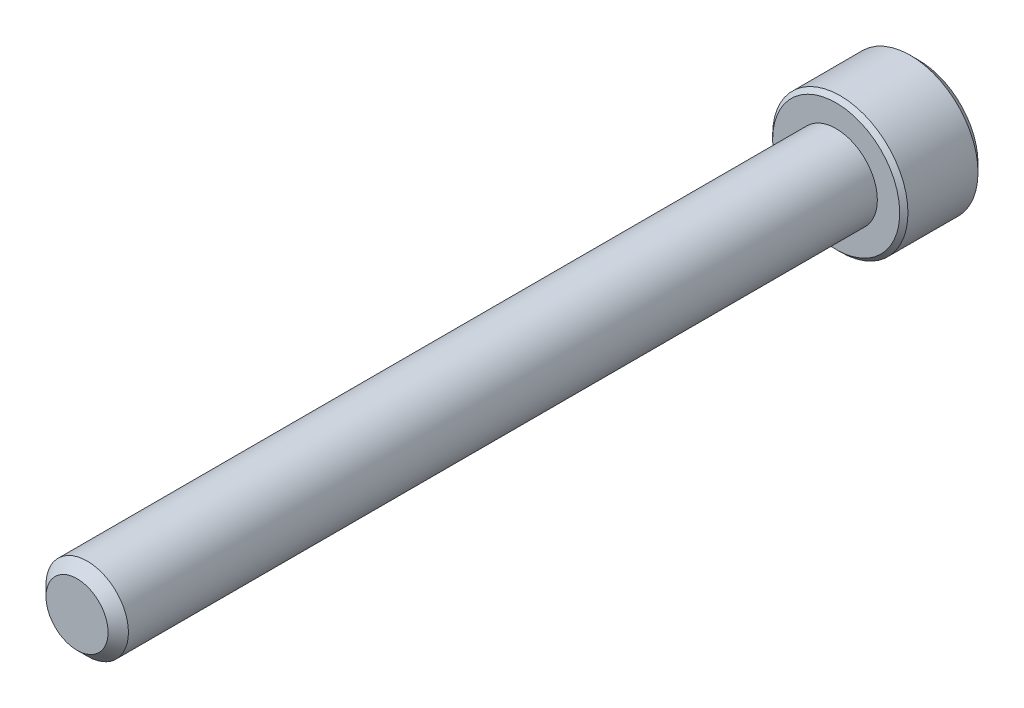
ISO-10303-21;
HEADER;
FILE_DESCRIPTION(('STEP AP214'),'2;1');
FILE_NAME('part.step','',(''),(''),'','','');
FILE_SCHEMA(('AUTOMOTIVE_DESIGN { 1 0 10303 214 1 1 1 1 }'));
ENDSEC;
DATA;
#1=APPLICATION_CONTEXT('core data for automotive mechanical design processes');
#2=APPLICATION_PROTOCOL_DEFINITION('international standard','automotive_design',2000,#1);
#3=PRODUCT_CONTEXT('',#1,'mechanical');
#4=PRODUCT('Part','Part','',(#3));
#5=PRODUCT_RELATED_PRODUCT_CATEGORY('part','',(#4));
#6=PRODUCT_DEFINITION_FORMATION('','',#4);
#7=PRODUCT_DEFINITION_CONTEXT('part definition',#1,'design');
#8=PRODUCT_DEFINITION('design','',#6,#7);
#9=PRODUCT_DEFINITION_SHAPE('','',#8);
#10=(LENGTH_UNIT() NAMED_UNIT(*) SI_UNIT(.MILLI.,.METRE.));
#11=(NAMED_UNIT(*) PLANE_ANGLE_UNIT() SI_UNIT($,.RADIAN.));
#12=(NAMED_UNIT(*) SI_UNIT($,.STERADIAN.) SOLID_ANGLE_UNIT());
#13=UNCERTAINTY_MEASURE_WITH_UNIT(LENGTH_MEASURE(1.E-05),#10,'distance_accuracy_value','');
#14=(GEOMETRIC_REPRESENTATION_CONTEXT(3) GLOBAL_UNCERTAINTY_ASSIGNED_CONTEXT((#13)) GLOBAL_UNIT_ASSIGNED_CONTEXT((#10,
#11,#12)) REPRESENTATION_CONTEXT('',''));
#15=CARTESIAN_POINT('',(0.,0.,0.));
#16=DIRECTION('',(0.,0.,1.));
#17=DIRECTION('',(1.,0.,0.));
#18=AXIS2_PLACEMENT_3D('',#15,#16,#17);
#19=CARTESIAN_POINT('',(-1.984375,-1.14567944042316,-46.2994375));
#20=DIRECTION('',(-1.,0.,0.));
#21=DIRECTION('',(0.,-1.,0.));
#22=AXIS2_PLACEMENT_3D('',#19,#20,#21);
#23=PLANE('',#22);
#24=CARTESIAN_POINT('',(-1.98437500000569,1.14567944037736,-49.2760000000724));
#25=CARTESIAN_POINT('',(-1.98437500000205,1.06743880337855,-49.2369161837469));
#26=CARTESIAN_POINT('',(-1.98437500000055,0.987898318922822,-49.2001144769719));
#27=CARTESIAN_POINT('',(-1.98437499999945,0.825677042023754,-49.1326562051319));
#28=CARTESIAN_POINT('',(-1.98437499999985,0.742979382541231,-49.1020405607383));
#29=CARTESIAN_POINT('',(-1.98437500000015,0.575193959601466,-49.049173922956));
#30=CARTESIAN_POINT('',(-1.98437500000004,0.49011535917917,-49.0268946209309));
#31=CARTESIAN_POINT('',(-1.98437499999996,0.318093091224654,-48.9925946723359));
#32=CARTESIAN_POINT('',(-1.984375,0.231156055087363,-48.9805423024016));
#33=CARTESIAN_POINT('',(-1.984375,0.119918521616488,-48.9724911027417));
#34=CARTESIAN_POINT('',(-1.984375,0.0959468443890642,-48.9711894756765));
#35=CARTESIAN_POINT('',(-1.984375,0.0479845644834222,-48.9694518263965));
#36=CARTESIAN_POINT('',(-1.984375,0.0239939791800526,-48.9690153339597));
#37=CARTESIAN_POINT('',(-1.984375,-0.0602201717358505,-48.9690180901815));
#38=CARTESIAN_POINT('',(-1.984375,-0.120461721885658,-48.9717745230961));
#39=CARTESIAN_POINT('',(-1.984375,-0.240474970949656,-48.9826365513448));
#40=CARTESIAN_POINT('',(-1.984375,-0.30024631270904,-48.9907458775915));
#41=CARTESIAN_POINT('',(-1.984375,-0.47876375272553,-49.0225962295593));
#42=CARTESIAN_POINT('',(-1.984375,-0.596208828839601,-49.0538542262027));
#43=CARTESIAN_POINT('',(-1.984375,-0.785921487332947,-49.117800036007));
#44=CARTESIAN_POINT('',(-1.984375,-0.859734609767017,-49.1462345777757));
#45=CARTESIAN_POINT('',(-1.984375,-1.00456595510842,-49.2078614041112));
#46=CARTESIAN_POINT('',(-1.984375,-1.07560356649368,-49.2410077931141));
#47=CARTESIAN_POINT('',(-1.984375,-1.14567944037646,-49.276000000075));
#48=B_SPLINE_CURVE_WITH_KNOTS('',3,(#24,#25,#26,#27,#28,#29,#30,#31,#32,#33,#34,#35,#36,#37,#38,
#39,#40,#41,#42,#43,#44,#45,#46,#47),.UNSPECIFIED.,.F.,.F.,(4,2,2,2,2,2,2,2,2,2,2,4),(0.,
0.262559005159571,0.526801735742144,0.790138824263276,1.05265603842961,1.12466619169623,
1.19663719492902,1.37727026717423,1.55802937197313,1.92104085072326,2.15819130077197,
2.39317265066356),.UNSPECIFIED.);
#49=CARTESIAN_POINT('',(-1.9843749999662,1.14567944040365,-49.2760000000593));
#50=VERTEX_POINT('',#49);
#51=CARTESIAN_POINT('',(-1.98437499996619,-1.14567944040365,-49.2760000000593));
#52=VERTEX_POINT('',#51);
#53=EDGE_CURVE('E21',#50,#52,#48,.T.);
#54=ORIENTED_EDGE('',*,*,#53,.F.);
#55=DIRECTION('',(0.,0.,1.));
#56=VECTOR('',#55,1.);
#57=CARTESIAN_POINT('',(-1.984375,1.14567944042316,-46.2994375));
#58=LINE('',#57,#56);
#59=CARTESIAN_POINT('',(-1.984375,1.14567944042316,-46.2994375));
#60=VERTEX_POINT('',#59);
#61=EDGE_CURVE('E65',#50,#60,#58,.T.);
#62=ORIENTED_EDGE('',*,*,#61,.T.);
#63=DIRECTION('',(0.,1.,0.));
#64=VECTOR('',#63,1.);
#65=CARTESIAN_POINT('',(-1.984375,3.43703832126949,-46.2994375));
#66=LINE('',#65,#64);
#67=CARTESIAN_POINT('',(-1.984375,-1.14567944042316,-46.2994375));
#68=VERTEX_POINT('',#67);
#69=EDGE_CURVE('E70',#68,#60,#66,.T.);
#70=ORIENTED_EDGE('',*,*,#69,.F.);
#71=DIRECTION('',(0.,0.,1.));
#72=VECTOR('',#71,1.);
#73=CARTESIAN_POINT('',(-1.984375,-1.14567944042316,-46.2994375));
#74=LINE('',#73,#72);
#75=EDGE_CURVE('E68',#68,#52,#74,.F.);
#76=ORIENTED_EDGE('',*,*,#75,.T.);
#77=EDGE_LOOP('',(#54,#62,#70,#76));
#78=FACE_BOUND('',#77,.T.);
#79=ADVANCED_FACE('F17',(#78),#23,.F.);
#80=CARTESIAN_POINT('',(1.984375,3.43703832126949,-46.2994375));
#81=DIRECTION('',(0.,0.,-1.));
#82=DIRECTION('',(-1.,0.,0.));
#83=AXIS2_PLACEMENT_3D('',#80,#81,#82);
#84=PLANE('',#83);
#85=DIRECTION('',(0.866025403784439,-0.5,0.));
#86=VECTOR('',#85,1.);
#87=CARTESIAN_POINT('',(0.,-2.29135888084633,-46.2994375));
#88=LINE('',#87,#86);
#89=CARTESIAN_POINT('',(0.,-2.29135888084633,-46.2994375));
#90=VERTEX_POINT('',#89);
#91=EDGE_CURVE('E88',#90,#68,#88,.F.);
#92=ORIENTED_EDGE('',*,*,#91,.T.);
#93=ORIENTED_EDGE('',*,*,#69,.T.);
#94=DIRECTION('',(-0.866025403784439,-0.5,0.));
#95=VECTOR('',#94,1.);
#96=CARTESIAN_POINT('',(-1.984375,1.14567944042316,-46.2994375));
#97=LINE('',#96,#95);
#98=CARTESIAN_POINT('',(0.,2.29135888084633,-46.2994375));
#99=VERTEX_POINT('',#98);
#100=EDGE_CURVE('E87',#60,#99,#97,.F.);
#101=ORIENTED_EDGE('',*,*,#100,.T.);
#102=DIRECTION('',(-0.866025403784439,0.5,0.));
#103=VECTOR('',#102,1.);
#104=CARTESIAN_POINT('',(0.,2.29135888084633,-46.2994375));
#105=LINE('',#104,#103);
#106=CARTESIAN_POINT('',(1.984375,1.14567944042316,-46.2994375));
#107=VERTEX_POINT('',#106);
#108=EDGE_CURVE('E228',#99,#107,#105,.F.);
#109=ORIENTED_EDGE('',*,*,#108,.T.);
#110=DIRECTION('',(0.,1.,0.));
#111=VECTOR('',#110,1.);
#112=CARTESIAN_POINT('',(1.984375,1.14567944042316,-46.2994375));
#113=LINE('',#112,#111);
#114=CARTESIAN_POINT('',(1.984375,-1.14567944042316,-46.2994375));
#115=VERTEX_POINT('',#114);
#116=EDGE_CURVE('E233',#107,#115,#113,.F.);
#117=ORIENTED_EDGE('',*,*,#116,.T.);
#118=DIRECTION('',(0.866025403784439,0.5,0.));
#119=VECTOR('',#118,1.);
#120=CARTESIAN_POINT('',(1.984375,-1.14567944042316,-46.2994375));
#121=LINE('',#120,#119);
#122=EDGE_CURVE('E238',#115,#90,#121,.F.);
#123=ORIENTED_EDGE('',*,*,#122,.T.);
#124=EDGE_LOOP('',(#92,#93,#101,#109,#117,#123));
#125=FACE_BOUND('',#124,.T.);
#126=ADVANCED_FACE('F164',(#125),#84,.T.);
#127=CARTESIAN_POINT('',(-1.984375,1.14567944042316,-46.2994375));
#128=DIRECTION('',(-0.5,0.866025403784439,0.));
#129=DIRECTION('',(-0.866025403784439,-0.5,0.));
#130=AXIS2_PLACEMENT_3D('',#127,#128,#129);
#131=PLANE('',#130);
#132=CARTESIAN_POINT('',(-1.98437499996318,1.14567944045099,-49.2760000000724));
#133=CARTESIAN_POINT('',(-1.91617106208917,1.18505700233814,-49.2366602280502));
#134=CARTESIAN_POINT('',(-1.84682675297547,1.22509295786997,-49.1996313285659));
#135=CARTESIAN_POINT('',(-1.70542659042468,1.30673037978086,-49.1318329943831));
#136=CARTESIAN_POINT('',(-1.63335729717257,1.34833960564073,-49.1011012703288));
#137=CARTESIAN_POINT('',(-1.48803310239598,1.4322425686151,-49.0484576202476));
#138=CARTESIAN_POINT('',(-1.41481519061416,1.47451494969172,-49.0264134121041));
#139=CARTESIAN_POINT('',(-1.26676792251345,1.55999007978236,-48.9924501108242));
#140=CARTESIAN_POINT('',(-1.19194308557433,1.60319021953126,-48.9805056748712));
#141=CARTESIAN_POINT('',(-1.06297903203566,1.67764765055762,-48.9697284276769));
#142=CARTESIAN_POINT('',(-1.00900630839441,1.70880881708079,-48.9681335281022));
#143=CARTESIAN_POINT('',(-0.901149169198747,1.77108016542942,-48.9708239215409));
#144=CARTESIAN_POINT('',(-0.847264791223809,1.80219032555837,-48.9751112756143));
#145=CARTESIAN_POINT('',(-0.740004920174074,1.86411684098218,-48.9893221943719));
#146=CARTESIAN_POINT('',(-0.686630064014173,1.89493282855405,-48.9992520606142));
#147=CARTESIAN_POINT('',(-0.580803363113345,1.9560319028066,-49.0242029486046));
#148=CARTESIAN_POINT('',(-0.528351447909329,1.98631503016915,-49.0392235799022));
#149=CARTESIAN_POINT('',(-0.394030915895689,2.06386502548492,-49.083804789159));
#150=CARTESIAN_POINT('',(-0.312994309055851,2.11065153225811,-49.1167221339899));
#151=CARTESIAN_POINT('',(-0.193836207810405,2.17944749408829,-49.1722895205279));
#152=CARTESIAN_POINT('',(-0.154568167025994,2.20211890800572,-49.1918130938936));
#153=CARTESIAN_POINT('',(-0.0767591724226134,2.24704195198536,-49.2326397007858));
#154=CARTESIAN_POINT('',(-0.0382177905119813,2.2692938292064,-49.2539416437533));
#155=CARTESIAN_POINT('',(-4.26691077844755E-11,2.29135888082169,-49.2760000000737));
#156=B_SPLINE_CURVE_WITH_KNOTS('',3,(#132,#133,#134,#135,#136,#137,#138,#139,#140,#141,#142,
#143,#144,#145,#146,#147,#148,#149,#150,#151,#152,#153,#154,#155),.UNSPECIFIED.,.F.,.F.,(4,2,2,
2,2,2,2,2,2,2,2,4),(0.,0.264284909610546,0.530108996326023,0.791712695366993,1.05265800168191,
1.23942150110466,1.42625045657599,1.61328847387906,1.80031214902356,2.09727151171491,
2.24534838932226,2.39333511874574),.UNSPECIFIED.);
#157=CARTESIAN_POINT('',(4.61209899294981E-11,2.29135888079489,-49.2760000000469));
#158=VERTEX_POINT('',#157);
#159=EDGE_CURVE('E84',#50,#158,#156,.T.);
#160=ORIENTED_EDGE('',*,*,#159,.T.);
#161=DIRECTION('',(0.,0.,1.));
#162=VECTOR('',#161,1.);
#163=CARTESIAN_POINT('',(0.,2.29135888084633,-46.2994375));
#164=LINE('',#163,#162);
#165=EDGE_CURVE('E95',#158,#99,#164,.T.);
#166=ORIENTED_EDGE('',*,*,#165,.T.);
#167=ORIENTED_EDGE('',*,*,#100,.F.);
#168=ORIENTED_EDGE('',*,*,#61,.F.);
#169=EDGE_LOOP('',(#160,#166,#167,#168));
#170=FACE_BOUND('',#169,.T.);
#171=ADVANCED_FACE('F82',(#170),#131,.F.);
#172=CARTESIAN_POINT('',(0.,-2.29135888084633,-46.2994375));
#173=DIRECTION('',(-0.5,-0.866025403784439,0.));
#174=DIRECTION('',(0.866025403784439,-0.5,0.));
#175=AXIS2_PLACEMENT_3D('',#172,#173,#174);
#176=PLANE('',#175);
#177=CARTESIAN_POINT('',(-4.43102107903869E-11,-2.29135888082571,-49.2760000000717));
#178=CARTESIAN_POINT('',(-0.0682039379147842,-2.25198131893322,-49.2366602280494));
#179=CARTESIAN_POINT('',(-0.137548247026928,-2.21194536339925,-49.199631328565));
#180=CARTESIAN_POINT('',(-0.278948409576329,-2.13030794148693,-49.1318329943824));
#181=CARTESIAN_POINT('',(-0.35101770282861,-2.08869871562778,-49.1011012703283));
#182=CARTESIAN_POINT('',(-0.496341897605045,-2.00479575265409,-49.0484576202473));
#183=CARTESIAN_POINT('',(-0.569559809386549,-1.96252337157745,-49.026413412104));
#184=CARTESIAN_POINT('',(-0.717607077486732,-1.87704824148695,-48.9924501108241));
#185=CARTESIAN_POINT('',(-0.792431914425647,-1.83384810173822,-48.9805056748713));
#186=CARTESIAN_POINT('',(-0.921395967964072,-1.75939067071204,-48.9697284276769));
#187=CARTESIAN_POINT('',(-0.975368691605297,-1.72822950418888,-48.9681335281022));
#188=CARTESIAN_POINT('',(-1.0832258308009,-1.66595815584027,-48.9708239215409));
#189=CARTESIAN_POINT('',(-1.13711020877582,-1.63484799571134,-48.9751112756143));
#190=CARTESIAN_POINT('',(-1.24437007982551,-1.57292148028756,-48.9893221943718));
#191=CARTESIAN_POINT('',(-1.29774493598539,-1.54210549271569,-48.9992520606142));
#192=CARTESIAN_POINT('',(-1.40357163688618,-1.48100641846317,-49.0242029486045));
#193=CARTESIAN_POINT('',(-1.45602355209018,-1.45072329110063,-49.039223579902));
#194=CARTESIAN_POINT('',(-1.59034408410431,-1.37317329578457,-49.083804789159));
#195=CARTESIAN_POINT('',(-1.67138069094465,-1.32638678901109,-49.1167221339901));
#196=CARTESIAN_POINT('',(-1.7905387921908,-1.2575908271805,-49.1722895205285));
#197=CARTESIAN_POINT('',(-1.82980683297544,-1.23491941326294,-49.1918130938943));
#198=CARTESIAN_POINT('',(-1.90761582757927,-1.18999636928305,-49.2326397007868));
#199=CARTESIAN_POINT('',(-1.94615720949012,-1.16774449206188,-49.2539416437544));
#200=CARTESIAN_POINT('',(-1.98437499995965,-1.14567944044646,-49.2760000000751));
#201=B_SPLINE_CURVE_WITH_KNOTS('',3,(#177,#178,#179,#180,#181,#182,#183,#184,#185,#186,#187,
#188,#189,#190,#191,#192,#193,#194,#195,#196,#197,#198,#199,#200),.UNSPECIFIED.,.F.,.F.,(4,2,2,
2,2,2,2,2,2,2,2,4),(0.,0.264284909609785,0.530108996324465,0.791712695364614,1.05265800167874,
1.23942150110139,1.42625045657263,1.61328847387562,1.80031214902005,2.09727151171322,
2.24534838932146,2.39333511874584),.UNSPECIFIED.);
#202=CARTESIAN_POINT('',(0.,-2.29135888080729,-49.2760000000593));
#203=VERTEX_POINT('',#202);
#204=EDGE_CURVE('E94',#203,#52,#201,.T.);
#205=ORIENTED_EDGE('',*,*,#204,.T.);
#206=ORIENTED_EDGE('',*,*,#75,.F.);
#207=ORIENTED_EDGE('',*,*,#91,.F.);
#208=DIRECTION('',(0.,0.,1.));
#209=VECTOR('',#208,1.);
#210=CARTESIAN_POINT('',(0.,-2.29135888084633,-46.2994375));
#211=LINE('',#210,#209);
#212=EDGE_CURVE('E236',#90,#203,#211,.F.);
#213=ORIENTED_EDGE('',*,*,#212,.T.);
#214=EDGE_LOOP('',(#205,#206,#207,#213));
#215=FACE_BOUND('',#214,.T.);
#216=ADVANCED_FACE('F155',(#215),#176,.F.);
#217=CARTESIAN_POINT('',(1.984375,-1.14567944042316,-46.2994375));
#218=DIRECTION('',(0.5,-0.866025403784439,0.));
#219=DIRECTION('',(0.866025403784439,0.5,0.));
#220=AXIS2_PLACEMENT_3D('',#217,#218,#219);
#221=PLANE('',#220);
#222=CARTESIAN_POINT('',(1.98437499995999,-1.14567944045123,-49.2760000000717));
#223=CARTESIAN_POINT('',(1.91617106208677,-1.18505700233895,-49.2366602280494));
#224=CARTESIAN_POINT('',(1.84682675297349,-1.22509295787096,-49.199631328565));
#225=CARTESIAN_POINT('',(1.70542659042326,-1.30673037978183,-49.1318329943824));
#226=CARTESIAN_POINT('',(1.63335729717129,-1.34833960564151,-49.1011012703283));
#227=CARTESIAN_POINT('',(1.48803310239508,-1.43224256861558,-49.0484576202473));
#228=CARTESIAN_POINT('',(1.41481519061349,-1.47451494969209,-49.026413412104));
#229=CARTESIAN_POINT('',(1.26676792251324,-1.55999007978249,-48.9924501108241));
#230=CARTESIAN_POINT('',(1.19194308557435,-1.60319021953126,-48.9805056748713));
#231=CARTESIAN_POINT('',(1.06297903203593,-1.67764765055746,-48.9697284276769));
#232=CARTESIAN_POINT('',(1.0090063083947,-1.70880881708062,-48.9681335281022));
#233=CARTESIAN_POINT('',(0.901149169199091,-1.77108016542922,-48.9708239215409));
#234=CARTESIAN_POINT('',(0.847264791224178,-1.80219032555816,-48.9751112756143));
#235=CARTESIAN_POINT('',(0.740004920174488,-1.86411684098194,-48.9893221943718));
#236=CARTESIAN_POINT('',(0.686630064014607,-1.8949328285538,-48.9992520606142));
#237=CARTESIAN_POINT('',(0.580803363113817,-1.95603190280633,-49.0242029486045));
#238=CARTESIAN_POINT('',(0.528351447909819,-1.98631503016887,-49.039223579902));
#239=CARTESIAN_POINT('',(0.394030915896102,-2.06386502548468,-49.0838047891588));
#240=CARTESIAN_POINT('',(0.312994309056173,-2.11065153225793,-49.1167221339897));
#241=CARTESIAN_POINT('',(0.1938362078106,-2.17944749408818,-49.1722895205278));
#242=CARTESIAN_POINT('',(0.154568167026149,-2.20211890800563,-49.1918130938935));
#243=CARTESIAN_POINT('',(0.076759172422692,-2.24704195198531,-49.2326397007858));
#244=CARTESIAN_POINT('',(0.0382177905120228,-2.26929382920638,-49.2539416437533));
#245=CARTESIAN_POINT('',(4.26725480533431E-11,-2.29135888082169,-49.2760000000737));
#246=B_SPLINE_CURVE_WITH_KNOTS('',3,(#222,#223,#224,#225,#226,#227,#228,#229,#230,#231,#232,
#233,#234,#235,#236,#237,#238,#239,#240,#241,#242,#243,#244,#245),.UNSPECIFIED.,.F.,.F.,(4,2,2,
2,2,2,2,2,2,2,2,4),(0.,0.264284909609778,0.530108996324448,0.791712695364608,1.05265800167874,
1.2394215011014,1.42625045657264,1.61328847387563,1.80031214902006,2.09727151171172,
2.24534838931922,2.39333511874285),.UNSPECIFIED.);
#247=CARTESIAN_POINT('',(1.98437499996619,-1.14567944040365,-49.2760000000593));
#248=VERTEX_POINT('',#247);
#249=EDGE_CURVE('E140',#248,#203,#246,.T.);
#250=ORIENTED_EDGE('',*,*,#249,.T.);
#251=ORIENTED_EDGE('',*,*,#212,.F.);
#252=ORIENTED_EDGE('',*,*,#122,.F.);
#253=DIRECTION('',(0.,0.,-1.));
#254=VECTOR('',#253,1.);
#255=CARTESIAN_POINT('',(1.984375,-1.14567944042316,-46.2994375));
#256=LINE('',#255,#254);
#257=EDGE_CURVE('E231',#115,#248,#256,.T.);
#258=ORIENTED_EDGE('',*,*,#257,.T.);
#259=EDGE_LOOP('',(#250,#251,#252,#258));
#260=FACE_BOUND('',#259,.T.);
#261=ADVANCED_FACE('F151',(#260),#221,.F.);
#262=CARTESIAN_POINT('',(1.984375,1.14567944042316,-46.2994375));
#263=DIRECTION('',(1.,0.,0.));
#264=DIRECTION('',(0.,0.,-1.));
#265=AXIS2_PLACEMENT_3D('',#262,#263,#264);
#266=PLANE('',#265);
#267=CARTESIAN_POINT('',(1.9843750000043,1.14567944037448,-49.2760000000717));
#268=CARTESIAN_POINT('',(1.98437500000155,1.06692431659428,-49.2366602280493));
#269=CARTESIAN_POINT('',(1.98437500000042,0.986852405528296,-49.199631328565));
#270=CARTESIAN_POINT('',(1.98437499999958,0.823577561705112,-49.1318329943824));
#271=CARTESIAN_POINT('',(1.98437499999989,0.74035910998627,-49.1011012703283));
#272=CARTESIAN_POINT('',(1.98437500000011,0.572553184038515,-49.0484576202473));
#273=CARTESIAN_POINT('',(1.98437500000003,0.488008421885358,-49.026413412104));
#274=CARTESIAN_POINT('',(1.98437499999997,0.317058161704457,-48.9924501108241));
#275=CARTESIAN_POINT('',(1.98437499999999,0.230657882206961,-48.9805056748713));
#276=CARTESIAN_POINT('',(1.984375,0.0817430201545726,-48.9697284276769));
#277=CARTESIAN_POINT('',(1.984375,0.0194206871082527,-48.9681335281022));
#278=CARTESIAN_POINT('',(1.984375,-0.105122009588963,-48.9708239215409));
#279=CARTESIAN_POINT('',(1.984375,-0.167342329846827,-48.9751112756143));
#280=CARTESIAN_POINT('',(1.984375,-0.291195360694394,-48.9893221943718));
#281=CARTESIAN_POINT('',(1.984375,-0.352827335838124,-48.9992520606142));
#282=CARTESIAN_POINT('',(1.984375,-0.475025484343166,-49.0242029486045));
#283=CARTESIAN_POINT('',(1.984375,-0.535591739068246,-49.039223579902));
#284=CARTESIAN_POINT('',(1.984375,-0.69069172969987,-49.0838047891588));
#285=CARTESIAN_POINT('',(1.984375,-0.78426474324636,-49.1167221339897));
#286=CARTESIAN_POINT('',(1.984375,-0.921856666906873,-49.1722895205278));
#287=CARTESIAN_POINT('',(1.984375,-0.967199494741777,-49.1918130938935));
#288=CARTESIAN_POINT('',(1.984375,-1.05704558270114,-49.2326397007858));
#289=CARTESIAN_POINT('',(1.984375,-1.10154933714327,-49.2539416437533));
#290=CARTESIAN_POINT('',(1.984375,-1.14567944037389,-49.2760000000737));
#291=B_SPLINE_CURVE_WITH_KNOTS('',3,(#267,#268,#269,#270,#271,#272,#273,#274,#275,#276,#277,
#278,#279,#280,#281,#282,#283,#284,#285,#286,#287,#288,#289,#290),.UNSPECIFIED.,.F.,.F.,(4,2,2,
2,2,2,2,2,2,2,2,4),(0.,0.264284909609778,0.530108996324449,0.79171269536461,1.05265800167874,
1.23942150110141,1.42625045657264,1.61328847387564,1.80031214902006,2.09727151171172,
2.24534838931922,2.39333511874285),.UNSPECIFIED.);
#292=CARTESIAN_POINT('',(1.9843749999662,1.14567944040365,-49.2760000000593));
#293=VERTEX_POINT('',#292);
#294=EDGE_CURVE('E104',#293,#248,#291,.T.);
#295=ORIENTED_EDGE('',*,*,#294,.T.);
#296=ORIENTED_EDGE('',*,*,#257,.F.);
#297=ORIENTED_EDGE('',*,*,#116,.F.);
#298=DIRECTION('',(0.,0.,1.));
#299=VECTOR('',#298,1.);
#300=CARTESIAN_POINT('',(1.984375,1.14567944042316,-46.2994375));
#301=LINE('',#300,#299);
#302=EDGE_CURVE('E40',#107,#293,#301,.F.);
#303=ORIENTED_EDGE('',*,*,#302,.T.);
#304=EDGE_LOOP('',(#295,#296,#297,#303));
#305=FACE_BOUND('',#304,.T.);
#306=ADVANCED_FACE('F154',(#305),#266,.F.);
#307=CARTESIAN_POINT('',(0.,2.29135888084633,-46.2994375));
#308=DIRECTION('',(0.5,0.866025403784439,0.));
#309=DIRECTION('',(-0.866025403784439,0.5,0.));
#310=AXIS2_PLACEMENT_3D('',#307,#308,#309);
#311=PLANE('',#310);
#312=CARTESIAN_POINT('',(4.43070080941302E-11,2.29135888082571,-49.2760000000717));
#313=CARTESIAN_POINT('',(0.0682039379147788,2.25198131893322,-49.2366602280493));
#314=CARTESIAN_POINT('',(0.137548247026921,2.21194536339925,-49.199631328565));
#315=CARTESIAN_POINT('',(0.27894840957632,2.13030794148694,-49.1318329943824));
#316=CARTESIAN_POINT('',(0.351017702828599,2.08869871562778,-49.1011012703283));
#317=CARTESIAN_POINT('',(0.496341897605036,2.0047957526541,-49.0484576202473));
#318=CARTESIAN_POINT('',(0.569559809386542,1.96252337157745,-49.026413412104));
#319=CARTESIAN_POINT('',(0.717607077486731,1.87704824148695,-48.9924501108241));
#320=CARTESIAN_POINT('',(0.792431914425649,1.83384810173822,-48.9805056748712));
#321=CARTESIAN_POINT('',(0.921395967964077,1.75939067071204,-48.9697284276769));
#322=CARTESIAN_POINT('',(0.975368691605302,1.72822950418887,-48.9681335281022));
#323=CARTESIAN_POINT('',(1.08322583080091,1.66595815584026,-48.9708239215409));
#324=CARTESIAN_POINT('',(1.13711020877582,1.63484799571133,-48.9751112756143));
#325=CARTESIAN_POINT('',(1.24437007982552,1.57292148028755,-48.9893221943718));
#326=CARTESIAN_POINT('',(1.2977449359854,1.54210549271568,-48.9992520606142));
#327=CARTESIAN_POINT('',(1.40357163688619,1.48100641846316,-49.0242029486045));
#328=CARTESIAN_POINT('',(1.45602355209019,1.45072329110062,-49.039223579902));
#329=CARTESIAN_POINT('',(1.5903440841039,1.37317329578481,-49.0838047891588));
#330=CARTESIAN_POINT('',(1.67138069094383,1.32638678901157,-49.1167221339897));
#331=CARTESIAN_POINT('',(1.7905387921894,1.25759082718131,-49.1722895205278));
#332=CARTESIAN_POINT('',(1.82980683297385,1.23491941326386,-49.1918130938935));
#333=CARTESIAN_POINT('',(1.90761582757731,1.18999636928418,-49.2326397007858));
#334=CARTESIAN_POINT('',(1.94615720948798,1.16774449206311,-49.2539416437533));
#335=CARTESIAN_POINT('',(1.98437499995733,1.1456794404478,-49.2760000000737));
#336=B_SPLINE_CURVE_WITH_KNOTS('',3,(#312,#313,#314,#315,#316,#317,#318,#319,#320,#321,#322,
#323,#324,#325,#326,#327,#328,#329,#330,#331,#332,#333,#334,#335),.UNSPECIFIED.,.F.,.F.,(4,2,2,
2,2,2,2,2,2,2,2,4),(0.,0.264284909609781,0.530108996324451,0.791712695364614,1.05265800167874,
1.2394215011014,1.42625045657264,1.61328847387564,1.80031214902006,2.09727151171173,
2.24534838931922,2.39333511874285),.UNSPECIFIED.);
#337=EDGE_CURVE('E102',#158,#293,#336,.T.);
#338=ORIENTED_EDGE('',*,*,#337,.T.);
#339=ORIENTED_EDGE('',*,*,#302,.F.);
#340=ORIENTED_EDGE('',*,*,#108,.F.);
#341=ORIENTED_EDGE('',*,*,#165,.F.);
#342=EDGE_LOOP('',(#338,#339,#340,#341));
#343=FACE_BOUND('',#342,.T.);
#344=ADVANCED_FACE('F119',(#343),#311,.F.);
#345=CARTESIAN_POINT('',(0.,0.,-49.2760000000203));
#346=DIRECTION('',(0.,0.,-1.));
#347=DIRECTION('',(0.,1.,0.));
#348=AXIS2_PLACEMENT_3D('',#345,#346,#347);
#349=CONICAL_SURFACE('',#348,2.29135888076826,0.785398163397448);
#350=ORIENTED_EDGE('',*,*,#159,.F.);
#351=CARTESIAN_POINT('',(0.,0.,-49.2760000000203));
#352=DIRECTION('',(0.,0.,-1.));
#353=DIRECTION('',(0.,1.,0.));
#354=AXIS2_PLACEMENT_3D('',#351,#352,#353);
#355=CIRCLE('',#354,2.29135888076826);
#356=EDGE_CURVE('E78',#158,#50,#355,.F.);
#357=ORIENTED_EDGE('',*,*,#356,.F.);
#358=EDGE_LOOP('',(#350,#357));
#359=FACE_BOUND('',#358,.T.);
#360=ADVANCED_FACE('F92',(#359),#349,.F.);
#361=CARTESIAN_POINT('',(0.,0.,-49.2760000000203));
#362=DIRECTION('',(0.,0.,-1.));
#363=DIRECTION('',(0.,1.,0.));
#364=AXIS2_PLACEMENT_3D('',#361,#362,#363);
#365=CONICAL_SURFACE('',#364,2.29135888076826,0.785398163397448);
#366=ORIENTED_EDGE('',*,*,#53,.T.);
#367=CARTESIAN_POINT('',(0.,0.,-49.2760000000203));
#368=DIRECTION('',(0.,0.,-1.));
#369=DIRECTION('',(0.,1.,0.));
#370=AXIS2_PLACEMENT_3D('',#367,#368,#369);
#371=CIRCLE('',#370,2.29135888076826);
#372=EDGE_CURVE('E72',#50,#52,#371,.F.);
#373=ORIENTED_EDGE('',*,*,#372,.F.);
#374=EDGE_LOOP('',(#366,#373));
#375=FACE_BOUND('',#374,.T.);
#376=ADVANCED_FACE('F73',(#375),#365,.F.);
#377=CARTESIAN_POINT('',(0.,0.,-49.2760000000203));
#378=DIRECTION('',(0.,0.,-1.));
#379=DIRECTION('',(0.,1.,0.));
#380=AXIS2_PLACEMENT_3D('',#377,#378,#379);
#381=CONICAL_SURFACE('',#380,2.29135888076826,0.785398163397448);
#382=ORIENTED_EDGE('',*,*,#204,.F.);
#383=CARTESIAN_POINT('',(0.,0.,-49.2760000000203));
#384=DIRECTION('',(0.,0.,-1.));
#385=DIRECTION('',(0.,1.,0.));
#386=AXIS2_PLACEMENT_3D('',#383,#384,#385);
#387=CIRCLE('',#386,2.29135888076826);
#388=EDGE_CURVE('E77',#52,#203,#387,.F.);
#389=ORIENTED_EDGE('',*,*,#388,.F.);
#390=EDGE_LOOP('',(#382,#389));
#391=FACE_BOUND('',#390,.T.);
#392=ADVANCED_FACE('F137',(#391),#381,.F.);
#393=CARTESIAN_POINT('',(0.,0.,-49.2760000000203));
#394=DIRECTION('',(0.,0.,-1.));
#395=DIRECTION('',(0.,1.,0.));
#396=AXIS2_PLACEMENT_3D('',#393,#394,#395);
#397=CONICAL_SURFACE('',#396,2.29135888076826,0.785398163397448);
#398=ORIENTED_EDGE('',*,*,#249,.F.);
#399=CARTESIAN_POINT('',(0.,0.,-49.2760000000203));
#400=DIRECTION('',(0.,0.,-1.));
#401=DIRECTION('',(0.,1.,0.));
#402=AXIS2_PLACEMENT_3D('',#399,#400,#401);
#403=CIRCLE('',#402,2.29135888076825);
#404=EDGE_CURVE('E279',#203,#248,#403,.F.);
#405=ORIENTED_EDGE('',*,*,#404,.F.);
#406=EDGE_LOOP('',(#398,#405));
#407=FACE_BOUND('',#406,.T.);
#408=ADVANCED_FACE('F132',(#407),#397,.F.);
#409=CARTESIAN_POINT('',(0.,0.,-49.2760000000203));
#410=DIRECTION('',(0.,0.,-1.));
#411=DIRECTION('',(0.,1.,0.));
#412=AXIS2_PLACEMENT_3D('',#409,#410,#411);
#413=CONICAL_SURFACE('',#412,2.29135888076826,0.785398163397448);
#414=ORIENTED_EDGE('',*,*,#294,.F.);
#415=CARTESIAN_POINT('',(0.,0.,-49.2760000000203));
#416=DIRECTION('',(0.,0.,-1.));
#417=DIRECTION('',(0.,1.,0.));
#418=AXIS2_PLACEMENT_3D('',#415,#416,#417);
#419=CIRCLE('',#418,2.29135888076826);
#420=EDGE_CURVE('E277',#248,#293,#419,.F.);
#421=ORIENTED_EDGE('',*,*,#420,.F.);
#422=EDGE_LOOP('',(#414,#421));
#423=FACE_BOUND('',#422,.T.);
#424=ADVANCED_FACE('F126',(#423),#413,.F.);
#425=CARTESIAN_POINT('',(0.,0.,-49.2760000000203));
#426=DIRECTION('',(0.,0.,-1.));
#427=DIRECTION('',(0.,1.,0.));
#428=AXIS2_PLACEMENT_3D('',#425,#426,#427);
#429=CONICAL_SURFACE('',#428,2.29135888076826,0.785398163397448);
#430=ORIENTED_EDGE('',*,*,#337,.F.);
#431=CARTESIAN_POINT('',(0.,0.,-49.2760000000203));
#432=DIRECTION('',(0.,0.,-1.));
#433=DIRECTION('',(0.,1.,0.));
#434=AXIS2_PLACEMENT_3D('',#431,#432,#433);
#435=CIRCLE('',#434,2.29135888076826);
#436=EDGE_CURVE('E101',#293,#158,#435,.F.);
#437=ORIENTED_EDGE('',*,*,#436,.F.);
#438=EDGE_LOOP('',(#430,#437));
#439=FACE_BOUND('',#438,.T.);
#440=ADVANCED_FACE('F122',(#439),#429,.F.);
#441=CARTESIAN_POINT('',(0.,0.,-49.276));
#442=DIRECTION('',(0.,0.,-1.));
#443=DIRECTION('',(-1.,0.,0.));
#444=AXIS2_PLACEMENT_3D('',#441,#442,#443);
#445=PLANE('',#444);
#446=ORIENTED_EDGE('',*,*,#420,.T.);
#447=ORIENTED_EDGE('',*,*,#436,.T.);
#448=ORIENTED_EDGE('',*,*,#356,.T.);
#449=ORIENTED_EDGE('',*,*,#372,.T.);
#450=ORIENTED_EDGE('',*,*,#388,.T.);
#451=ORIENTED_EDGE('',*,*,#404,.T.);
#452=EDGE_LOOP('',(#446,#447,#448,#449,#450,#451));
#453=FACE_BOUND('',#452,.T.);
#454=CARTESIAN_POINT('',(0.,0.,-49.2759999999066));
#455=DIRECTION('',(0.,0.,1.));
#456=DIRECTION('',(1.,0.,0.));
#457=AXIS2_PLACEMENT_3D('',#454,#455,#456);
#458=CIRCLE('',#457,3.4797999999796);
#459=CARTESIAN_POINT('',(3.4797999999796,0.,-49.2759999999066));
#460=VERTEX_POINT('',#459);
#461=EDGE_CURVE('E213',#460,#460,#458,.T.);
#462=ORIENTED_EDGE('',*,*,#461,.F.);
#463=EDGE_LOOP('',(#462));
#464=FACE_BOUND('',#463,.T.);
#465=ADVANCED_FACE('F98',(#453,#464),#445,.T.);
#466=CARTESIAN_POINT('',(0.,0.,-48.7934000000223));
#467=DIRECTION('',(0.,0.,1.));
#468=DIRECTION('',(1.,0.,0.));
#469=AXIS2_PLACEMENT_3D('',#466,#467,#468);
#470=CONICAL_SURFACE('',#469,3.96239999992076,0.785398163456341);
#471=ORIENTED_EDGE('',*,*,#461,.T.);
#472=EDGE_LOOP('',(#471));
#473=FACE_BOUND('',#472,.T.);
#474=CARTESIAN_POINT('',(0.,0.,-48.7934));
#475=DIRECTION('',(0.,0.,1.));
#476=DIRECTION('',(1.,0.,0.));
#477=AXIS2_PLACEMENT_3D('',#474,#475,#476);
#478=CIRCLE('',#477,3.9624);
#479=CARTESIAN_POINT('',(3.9624,0.,-48.7934));
#480=VERTEX_POINT('',#479);
#481=EDGE_CURVE('E216',#480,#480,#478,.T.);
#482=ORIENTED_EDGE('',*,*,#481,.F.);
#483=EDGE_LOOP('',(#482));
#484=FACE_BOUND('',#483,.T.);
#485=ADVANCED_FACE('F203',(#473,#484),#470,.T.);
#486=CARTESIAN_POINT('',(0.,0.,-49.276));
#487=DIRECTION('',(0.,0.,1.));
#488=DIRECTION('',(1.,0.,0.));
#489=AXIS2_PLACEMENT_3D('',#486,#487,#488);
#490=CYLINDRICAL_SURFACE('',#489,3.9624);
#491=ORIENTED_EDGE('',*,*,#481,.T.);
#492=EDGE_LOOP('',(#491));
#493=FACE_BOUND('',#492,.T.);
#494=CARTESIAN_POINT('',(0.,0.,-44.6913000000109));
#495=DIRECTION('',(0.,0.,-1.));
#496=DIRECTION('',(-1.,0.,0.));
#497=AXIS2_PLACEMENT_3D('',#494,#495,#496);
#498=CIRCLE('',#497,3.96239999992076);
#499=CARTESIAN_POINT('',(-3.96239999992076,0.,-44.6913000000109));
#500=VERTEX_POINT('',#499);
#501=EDGE_CURVE('E217',#500,#500,#498,.F.);
#502=ORIENTED_EDGE('',*,*,#501,.F.);
#503=EDGE_LOOP('',(#502));
#504=FACE_BOUND('',#503,.T.);
#505=ADVANCED_FACE('F200',(#493,#504),#490,.T.);
#506=CARTESIAN_POINT('',(0.,0.,-44.6912999998972));
#507=DIRECTION('',(0.,0.,-1.));
#508=DIRECTION('',(-1.,0.,0.));
#509=AXIS2_PLACEMENT_3D('',#506,#507,#508);
#510=CONICAL_SURFACE('',#509,3.96239999986392,0.785398163397448);
#511=CARTESIAN_POINT('',(0.,0.,-44.4499999999834));
#512=DIRECTION('',(0.,0.,-1.));
#513=DIRECTION('',(-1.,0.,0.));
#514=AXIS2_PLACEMENT_3D('',#511,#512,#513);
#515=CIRCLE('',#514,3.72109999995018);
#516=CARTESIAN_POINT('',(-3.72109999995018,0.,-44.4499999999834));
#517=VERTEX_POINT('',#516);
#518=EDGE_CURVE('E220',#517,#517,#515,.T.);
#519=ORIENTED_EDGE('',*,*,#518,.T.);
#520=EDGE_LOOP('',(#519));
#521=FACE_BOUND('',#520,.T.);
#522=ORIENTED_EDGE('',*,*,#501,.T.);
#523=EDGE_LOOP('',(#522));
#524=FACE_BOUND('',#523,.T.);
#525=ADVANCED_FACE('F196',(#521,#524),#510,.T.);
#526=CARTESIAN_POINT('',(0.,0.,0.));
#527=DIRECTION('',(0.,0.,1.));
#528=DIRECTION('',(1.,0.,0.));
#529=AXIS2_PLACEMENT_3D('',#526,#527,#528);
#530=PLANE('',#529);
#531=CARTESIAN_POINT('',(0.,0.,0.));
#532=DIRECTION('',(0.,0.,-1.));
#533=DIRECTION('',(-1.,0.,0.));
#534=AXIS2_PLACEMENT_3D('',#531,#532,#533);
#535=CIRCLE('',#534,1.8176875000222);
#536=CARTESIAN_POINT('',(-1.8176875000222,0.,0.));
#537=VERTEX_POINT('',#536);
#538=EDGE_CURVE('E271',#537,#537,#535,.T.);
#539=ORIENTED_EDGE('',*,*,#538,.F.);
#540=EDGE_LOOP('',(#539));
#541=FACE_BOUND('',#540,.T.);
#542=ADVANCED_FACE('F192',(#541),#530,.T.);
#543=CARTESIAN_POINT('',(0.,0.,-44.45));
#544=DIRECTION('',(0.,0.,-1.));
#545=DIRECTION('',(-1.,0.,0.));
#546=AXIS2_PLACEMENT_3D('',#543,#544,#545);
#547=PLANE('',#546);
#548=CARTESIAN_POINT('',(0.,0.,-44.45));
#549=DIRECTION('',(0.,0.,1.));
#550=DIRECTION('',(1.,0.,0.));
#551=AXIS2_PLACEMENT_3D('',#548,#549,#550);
#552=CIRCLE('',#551,2.413);
#553=CARTESIAN_POINT('',(2.413,0.,-44.45));
#554=VERTEX_POINT('',#553);
#555=EDGE_CURVE('E31',#554,#554,#552,.T.);
#556=ORIENTED_EDGE('',*,*,#555,.F.);
#557=EDGE_LOOP('',(#556));
#558=FACE_BOUND('',#557,.T.);
#559=ORIENTED_EDGE('',*,*,#518,.F.);
#560=EDGE_LOOP('',(#559));
#561=FACE_BOUND('',#560,.T.);
#562=ADVANCED_FACE('F185',(#558,#561),#547,.F.);
#563=CARTESIAN_POINT('',(0.,0.,-0.595312499967804));
#564=DIRECTION('',(0.,0.,-1.));
#565=DIRECTION('',(-1.,0.,0.));
#566=AXIS2_PLACEMENT_3D('',#563,#564,#565);
#567=CONICAL_SURFACE('',#566,2.41299999999001,0.785398163397448);
#568=CARTESIAN_POINT('',(0.,0.,-0.595312500000007));
#569=DIRECTION('',(0.,0.,1.));
#570=DIRECTION('',(1.,0.,0.));
#571=AXIS2_PLACEMENT_3D('',#568,#569,#570);
#572=CIRCLE('',#571,2.413);
#573=CARTESIAN_POINT('',(2.413,0.,-0.595312500000007));
#574=VERTEX_POINT('',#573);
#575=EDGE_CURVE('E11',#574,#574,#572,.F.);
#576=ORIENTED_EDGE('',*,*,#575,.F.);
#577=EDGE_LOOP('',(#576));
#578=FACE_BOUND('',#577,.T.);
#579=ORIENTED_EDGE('',*,*,#538,.T.);
#580=EDGE_LOOP('',(#579));
#581=FACE_BOUND('',#580,.T.);
#582=ADVANCED_FACE('F179',(#578,#581),#567,.T.);
#583=CARTESIAN_POINT('',(0.,0.,-44.45));
#584=DIRECTION('',(0.,0.,1.));
#585=DIRECTION('',(1.,0.,0.));
#586=AXIS2_PLACEMENT_3D('',#583,#584,#585);
#587=CYLINDRICAL_SURFACE('',#586,2.413);
#588=ORIENTED_EDGE('',*,*,#575,.T.);
#589=EDGE_LOOP('',(#588));
#590=FACE_BOUND('',#589,.T.);
#591=ORIENTED_EDGE('',*,*,#555,.T.);
#592=EDGE_LOOP('',(#591));
#593=FACE_BOUND('',#592,.T.);
#594=ADVANCED_FACE('F177',(#590,#593),#587,.T.);
#595=CLOSED_SHELL('',(#79,#126,#171,#216,#261,#306,#344,#360,#376,#392,#408,#424,#440,#465,#485,
#505,#525,#542,#562,#582,#594));
#596=MANIFOLD_SOLID_BREP('B1',#595);
#597=ADVANCED_BREP_SHAPE_REPRESENTATION('',(#18,#596),#14);
#598=SHAPE_DEFINITION_REPRESENTATION(#9,#597);
ENDSEC;
END-ISO-10303-21;
